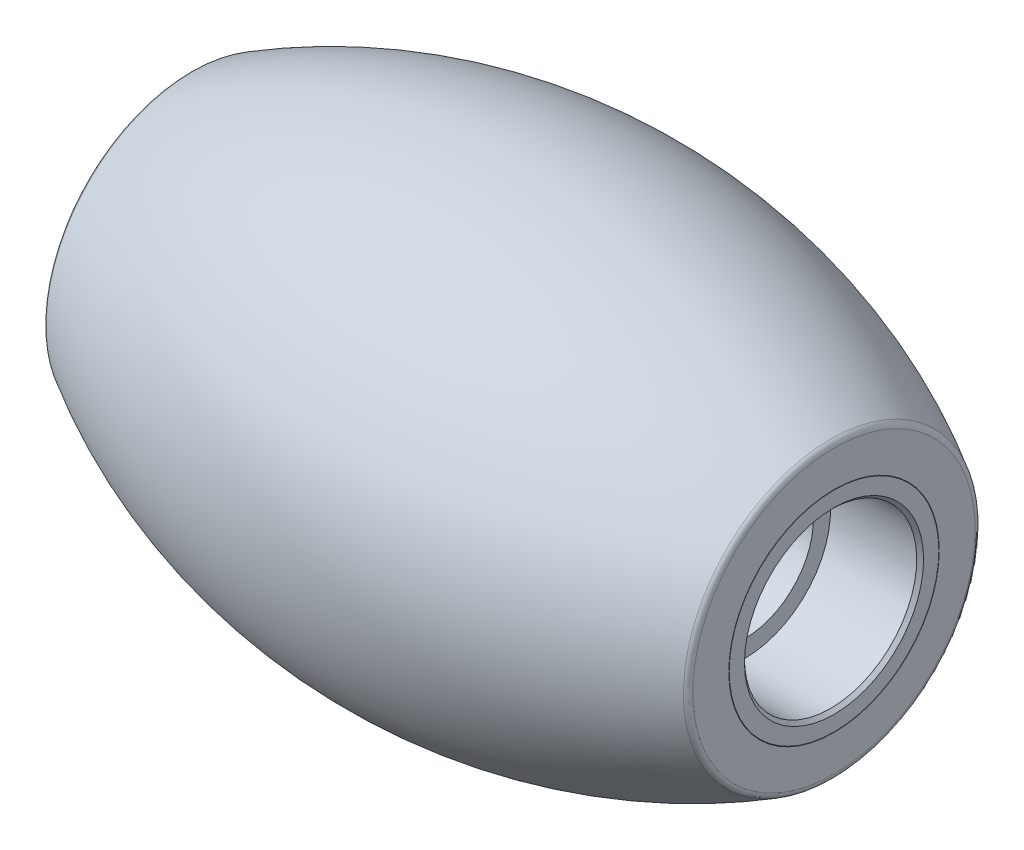
ISO-10303-21;
HEADER;
FILE_DESCRIPTION(('STEP AP214'),'2;1');
FILE_NAME('part.step','',(''),(''),'','','');
FILE_SCHEMA(('AUTOMOTIVE_DESIGN { 1 0 10303 214 1 1 1 1 }'));
ENDSEC;
DATA;
#1=APPLICATION_CONTEXT('core data for automotive mechanical design processes');
#2=APPLICATION_PROTOCOL_DEFINITION('international standard','automotive_design',2000,#1);
#3=PRODUCT_CONTEXT('',#1,'mechanical');
#4=PRODUCT('Part','Part','',(#3));
#5=PRODUCT_RELATED_PRODUCT_CATEGORY('part','',(#4));
#6=PRODUCT_DEFINITION_FORMATION('','',#4);
#7=PRODUCT_DEFINITION_CONTEXT('part definition',#1,'design');
#8=PRODUCT_DEFINITION('design','',#6,#7);
#9=PRODUCT_DEFINITION_SHAPE('','',#8);
#10=(LENGTH_UNIT() NAMED_UNIT(*) SI_UNIT(.MILLI.,.METRE.));
#11=(NAMED_UNIT(*) PLANE_ANGLE_UNIT() SI_UNIT($,.RADIAN.));
#12=(NAMED_UNIT(*) SI_UNIT($,.STERADIAN.) SOLID_ANGLE_UNIT());
#13=UNCERTAINTY_MEASURE_WITH_UNIT(LENGTH_MEASURE(1.E-05),#10,'distance_accuracy_value','');
#14=(GEOMETRIC_REPRESENTATION_CONTEXT(3) GLOBAL_UNCERTAINTY_ASSIGNED_CONTEXT((#13)) GLOBAL_UNIT_ASSIGNED_CONTEXT((#10,
#11,#12)) REPRESENTATION_CONTEXT('',''));
#15=CARTESIAN_POINT('',(0.,0.,0.));
#16=DIRECTION('',(0.,0.,1.));
#17=DIRECTION('',(1.,0.,0.));
#18=AXIS2_PLACEMENT_3D('',#15,#16,#17);
#19=CARTESIAN_POINT('',(0.,0.,0.));
#20=DIRECTION('',(-1.,0.,0.));
#21=DIRECTION('',(0.,-1.,0.));
#22=AXIS2_PLACEMENT_3D('',#19,#20,#21);
#23=DEGENERATE_TOROIDAL_SURFACE('',#22,11.75,17.51,.F.);
#24=CARTESIAN_POINT('',(9.35,0.,0.));
#25=DIRECTION('',(-1.,0.,0.));
#26=DIRECTION('',(0.,-1.,0.));
#27=AXIS2_PLACEMENT_3D('',#24,#25,#26);
#28=CIRCLE('',#27,3.05464791881252);
#29=CARTESIAN_POINT('',(9.35,-3.05464791881252,0.));
#30=VERTEX_POINT('',#29);
#31=EDGE_CURVE('E62',#30,#30,#28,.T.);
#32=ORIENTED_EDGE('',*,*,#31,.F.);
#33=EDGE_LOOP('',(#32));
#34=FACE_BOUND('',#33,.T.);
#35=CARTESIAN_POINT('',(-9.35,0.,0.));
#36=DIRECTION('',(-1.,0.,0.));
#37=DIRECTION('',(0.,-1.,0.));
#38=AXIS2_PLACEMENT_3D('',#35,#36,#37);
#39=CIRCLE('',#38,3.05464791881252);
#40=CARTESIAN_POINT('',(-9.35,-3.05464791881252,0.));
#41=VERTEX_POINT('',#40);
#42=EDGE_CURVE('E65',#41,#41,#39,.T.);
#43=ORIENTED_EDGE('',*,*,#42,.T.);
#44=EDGE_LOOP('',(#43));
#45=FACE_BOUND('',#44,.T.);
#46=ADVANCED_FACE('F42',(#34,#45),#23,.T.);
#47=CARTESIAN_POINT('',(9.35,3.05464791881252,0.));
#48=DIRECTION('',(-1.,0.,0.));
#49=DIRECTION('',(0.,-1.,0.));
#50=AXIS2_PLACEMENT_3D('',#47,#48,#49);
#51=PLANE('',#50);
#52=CARTESIAN_POINT('',(9.35,0.,0.));
#53=DIRECTION('',(-1.,0.,0.));
#54=DIRECTION('',(0.,-1.,0.));
#55=AXIS2_PLACEMENT_3D('',#52,#53,#54);
#56=CIRCLE('',#55,4.09826488925523);
#57=CARTESIAN_POINT('',(9.35,-4.09826488925522,0.));
#58=VERTEX_POINT('',#57);
#59=EDGE_CURVE('E11',#58,#58,#56,.F.);
#60=ORIENTED_EDGE('',*,*,#59,.T.);
#61=EDGE_LOOP('',(#60));
#62=FACE_BOUND('',#61,.T.);
#63=ORIENTED_EDGE('',*,*,#31,.T.);
#64=EDGE_LOOP('',(#63));
#65=FACE_BOUND('',#64,.T.);
#66=ADVANCED_FACE('F81',(#62,#65),#51,.F.);
#67=CARTESIAN_POINT('',(0.,0.,0.));
#68=DIRECTION('',(-1.,0.,0.));
#69=DIRECTION('',(0.,-1.,0.));
#70=AXIS2_PLACEMENT_3D('',#67,#68,#69);
#71=DEGENERATE_TOROIDAL_SURFACE('',#70,11.75,18.5,.F.);
#72=CARTESIAN_POINT('',(-9.25,0.,0.));
#73=DIRECTION('',(1.,0.,0.));
#74=DIRECTION('',(0.,1.,0.));
#75=AXIS2_PLACEMENT_3D('',#72,#73,#74);
#76=CIRCLE('',#75,4.27146997001212);
#77=CARTESIAN_POINT('',(-9.25,4.27146997001212,0.));
#78=VERTEX_POINT('',#77);
#79=EDGE_CURVE('E49',#78,#78,#76,.T.);
#80=ORIENTED_EDGE('',*,*,#79,.T.);
#81=EDGE_LOOP('',(#80));
#82=FACE_BOUND('',#81,.T.);
#83=CARTESIAN_POINT('',(9.25,0.,0.));
#84=DIRECTION('',(-1.,0.,0.));
#85=DIRECTION('',(0.,-1.,0.));
#86=AXIS2_PLACEMENT_3D('',#83,#84,#85);
#87=CIRCLE('',#86,4.27146997001211);
#88=CARTESIAN_POINT('',(9.25,-4.27146997001211,0.));
#89=VERTEX_POINT('',#88);
#90=EDGE_CURVE('E53',#89,#89,#87,.T.);
#91=ORIENTED_EDGE('',*,*,#90,.T.);
#92=EDGE_LOOP('',(#91));
#93=FACE_BOUND('',#92,.T.);
#94=ADVANCED_FACE('F73',(#82,#93),#71,.F.);
#95=CARTESIAN_POINT('',(-9.35,3.05464791881252,0.));
#96=DIRECTION('',(1.,0.,0.));
#97=DIRECTION('',(0.,1.,0.));
#98=AXIS2_PLACEMENT_3D('',#95,#96,#97);
#99=PLANE('',#98);
#100=CARTESIAN_POINT('',(-9.35,0.,0.));
#101=DIRECTION('',(1.,0.,0.));
#102=DIRECTION('',(0.,1.,0.));
#103=AXIS2_PLACEMENT_3D('',#100,#101,#102);
#104=CIRCLE('',#103,4.09826488925523);
#105=CARTESIAN_POINT('',(-9.35,4.09826488925523,0.));
#106=VERTEX_POINT('',#105);
#107=EDGE_CURVE('E57',#106,#106,#104,.F.);
#108=ORIENTED_EDGE('',*,*,#107,.T.);
#109=EDGE_LOOP('',(#108));
#110=FACE_BOUND('',#109,.T.);
#111=ORIENTED_EDGE('',*,*,#42,.F.);
#112=EDGE_LOOP('',(#111));
#113=FACE_BOUND('',#112,.T.);
#114=ADVANCED_FACE('F70',(#110,#113),#99,.F.);
#115=CARTESIAN_POINT('',(-9.15,0.,0.));
#116=DIRECTION('',(1.,0.,0.));
#117=DIRECTION('',(0.,1.,0.));
#118=AXIS2_PLACEMENT_3D('',#115,#116,#117);
#119=TOROIDAL_SURFACE('',#118,4.09826488925523,0.2);
#120=ORIENTED_EDGE('',*,*,#79,.F.);
#121=EDGE_LOOP('',(#120));
#122=FACE_BOUND('',#121,.T.);
#123=ORIENTED_EDGE('',*,*,#107,.F.);
#124=EDGE_LOOP('',(#123));
#125=FACE_BOUND('',#124,.T.);
#126=ADVANCED_FACE('F72',(#122,#125),#119,.T.);
#127=CARTESIAN_POINT('',(9.15,0.,0.));
#128=DIRECTION('',(-1.,0.,0.));
#129=DIRECTION('',(0.,-1.,0.));
#130=AXIS2_PLACEMENT_3D('',#127,#128,#129);
#131=TOROIDAL_SURFACE('',#130,4.09826488925523,0.2);
#132=ORIENTED_EDGE('',*,*,#59,.F.);
#133=EDGE_LOOP('',(#132));
#134=FACE_BOUND('',#133,.T.);
#135=ORIENTED_EDGE('',*,*,#90,.F.);
#136=EDGE_LOOP('',(#135));
#137=FACE_BOUND('',#136,.T.);
#138=ADVANCED_FACE('F44',(#134,#137),#131,.T.);
#139=CLOSED_SHELL('',(#46,#66,#94,#114,#126,#138));
#140=MANIFOLD_SOLID_BREP('B2',#139);
#141=CARTESIAN_POINT('',(-9.35,3.04281920392459,0.));
#142=DIRECTION('',(1.,0.,0.));
#143=DIRECTION('',(0.,1.,0.));
#144=AXIS2_PLACEMENT_3D('',#141,#142,#143);
#145=PLANE('',#144);
#146=CARTESIAN_POINT('',(-9.35,0.,0.));
#147=DIRECTION('',(1.,0.,0.));
#148=DIRECTION('',(0.,1.,0.));
#149=AXIS2_PLACEMENT_3D('',#146,#147,#148);
#150=CIRCLE('',#149,2.6);
#151=CARTESIAN_POINT('',(-9.35,2.6,0.));
#152=VERTEX_POINT('',#151);
#153=EDGE_CURVE('E144',#152,#152,#150,.T.);
#154=ORIENTED_EDGE('',*,*,#153,.T.);
#155=EDGE_LOOP('',(#154));
#156=FACE_BOUND('',#155,.T.);
#157=CARTESIAN_POINT('',(-9.35,0.,0.));
#158=DIRECTION('',(-1.,0.,0.));
#159=DIRECTION('',(0.,-1.,0.));
#160=AXIS2_PLACEMENT_3D('',#157,#158,#159);
#161=CIRCLE('',#160,3.04281920392459);
#162=CARTESIAN_POINT('',(-9.35,-3.04281920392459,0.));
#163=VERTEX_POINT('',#162);
#164=EDGE_CURVE('E153',#163,#163,#161,.T.);
#165=ORIENTED_EDGE('',*,*,#164,.T.);
#166=EDGE_LOOP('',(#165));
#167=FACE_BOUND('',#166,.T.);
#168=ADVANCED_FACE('F133',(#156,#167),#145,.F.);
#169=CARTESIAN_POINT('',(9.35,0.,0.));
#170=DIRECTION('',(-1.,0.,0.));
#171=DIRECTION('',(0.,-1.,0.));
#172=AXIS2_PLACEMENT_3D('',#169,#170,#171);
#173=PLANE('',#172);
#174=CARTESIAN_POINT('',(9.35,0.,0.));
#175=DIRECTION('',(-1.,0.,0.));
#176=DIRECTION('',(0.,-1.,0.));
#177=AXIS2_PLACEMENT_3D('',#174,#175,#176);
#178=CIRCLE('',#177,2.6);
#179=CARTESIAN_POINT('',(9.35,-2.59999999999999,0.));
#180=VERTEX_POINT('',#179);
#181=EDGE_CURVE('E140',#180,#180,#178,.T.);
#182=ORIENTED_EDGE('',*,*,#181,.T.);
#183=EDGE_LOOP('',(#182));
#184=FACE_BOUND('',#183,.T.);
#185=CARTESIAN_POINT('',(9.35,0.,0.));
#186=DIRECTION('',(-1.,0.,0.));
#187=DIRECTION('',(0.,-1.,0.));
#188=AXIS2_PLACEMENT_3D('',#185,#186,#187);
#189=CIRCLE('',#188,3.04281920392458);
#190=CARTESIAN_POINT('',(9.35,-3.04281920392458,0.));
#191=VERTEX_POINT('',#190);
#192=EDGE_CURVE('E156',#191,#191,#189,.T.);
#193=ORIENTED_EDGE('',*,*,#192,.F.);
#194=EDGE_LOOP('',(#193));
#195=FACE_BOUND('',#194,.T.);
#196=ADVANCED_FACE('F188',(#184,#195),#173,.F.);
#197=CARTESIAN_POINT('',(0.,0.,0.));
#198=DIRECTION('',(-1.,0.,0.));
#199=DIRECTION('',(0.,-1.,0.));
#200=AXIS2_PLACEMENT_3D('',#197,#198,#199);
#201=DEGENERATE_TOROIDAL_SURFACE('',#200,11.75,17.5,.F.);
#202=ORIENTED_EDGE('',*,*,#164,.F.);
#203=EDGE_LOOP('',(#202));
#204=FACE_BOUND('',#203,.T.);
#205=ORIENTED_EDGE('',*,*,#192,.T.);
#206=EDGE_LOOP('',(#205));
#207=FACE_BOUND('',#206,.T.);
#208=ADVANCED_FACE('F194',(#204,#207),#201,.F.);
#209=CARTESIAN_POINT('',(-9.35,0.,0.));
#210=DIRECTION('',(-1.,0.,0.));
#211=DIRECTION('',(0.,-1.,0.));
#212=AXIS2_PLACEMENT_3D('',#209,#210,#211);
#213=CYLINDRICAL_SURFACE('',#212,2.5);
#214=CARTESIAN_POINT('',(9.25,0.,0.));
#215=DIRECTION('',(-1.,0.,0.));
#216=DIRECTION('',(0.,-1.,0.));
#217=AXIS2_PLACEMENT_3D('',#214,#215,#216);
#218=CIRCLE('',#217,2.5);
#219=CARTESIAN_POINT('',(9.25,-2.49999999999999,0.));
#220=VERTEX_POINT('',#219);
#221=EDGE_CURVE('E41',#220,#220,#218,.F.);
#222=ORIENTED_EDGE('',*,*,#221,.T.);
#223=EDGE_LOOP('',(#222));
#224=FACE_BOUND('',#223,.T.);
#225=CARTESIAN_POINT('',(6.75,0.,0.));
#226=DIRECTION('',(-1.,0.,0.));
#227=DIRECTION('',(0.,-1.,0.));
#228=AXIS2_PLACEMENT_3D('',#225,#226,#227);
#229=CIRCLE('',#228,2.5);
#230=CARTESIAN_POINT('',(6.75,-2.49999999999999,0.));
#231=VERTEX_POINT('',#230);
#232=EDGE_CURVE('E159',#231,#231,#229,.T.);
#233=ORIENTED_EDGE('',*,*,#232,.T.);
#234=EDGE_LOOP('',(#233));
#235=FACE_BOUND('',#234,.T.);
#236=ADVANCED_FACE('F199',(#224,#235),#213,.F.);
#237=CARTESIAN_POINT('',(6.75,2.,0.));
#238=DIRECTION('',(1.,0.,0.));
#239=DIRECTION('',(0.,1.,0.));
#240=AXIS2_PLACEMENT_3D('',#237,#238,#239);
#241=PLANE('',#240);
#242=CARTESIAN_POINT('',(6.75,0.,0.));
#243=DIRECTION('',(-1.,0.,0.));
#244=DIRECTION('',(0.,-1.,0.));
#245=AXIS2_PLACEMENT_3D('',#242,#243,#244);
#246=CIRCLE('',#245,2.);
#247=CARTESIAN_POINT('',(6.75,-1.99999999999999,0.));
#248=VERTEX_POINT('',#247);
#249=EDGE_CURVE('E162',#248,#248,#246,.T.);
#250=ORIENTED_EDGE('',*,*,#249,.T.);
#251=EDGE_LOOP('',(#250));
#252=FACE_BOUND('',#251,.T.);
#253=ORIENTED_EDGE('',*,*,#232,.F.);
#254=EDGE_LOOP('',(#253));
#255=FACE_BOUND('',#254,.T.);
#256=ADVANCED_FACE('F204',(#252,#255),#241,.T.);
#257=CARTESIAN_POINT('',(-9.35,0.,0.));
#258=DIRECTION('',(-1.,0.,0.));
#259=DIRECTION('',(0.,-1.,0.));
#260=AXIS2_PLACEMENT_3D('',#257,#258,#259);
#261=CYLINDRICAL_SURFACE('',#260,2.);
#262=CARTESIAN_POINT('',(-6.75,0.,0.));
#263=DIRECTION('',(-1.,0.,0.));
#264=DIRECTION('',(0.,-1.,0.));
#265=AXIS2_PLACEMENT_3D('',#262,#263,#264);
#266=CIRCLE('',#265,2.);
#267=CARTESIAN_POINT('',(-6.75,-2.,0.));
#268=VERTEX_POINT('',#267);
#269=EDGE_CURVE('E165',#268,#268,#266,.T.);
#270=ORIENTED_EDGE('',*,*,#269,.T.);
#271=EDGE_LOOP('',(#270));
#272=FACE_BOUND('',#271,.T.);
#273=ORIENTED_EDGE('',*,*,#249,.F.);
#274=EDGE_LOOP('',(#273));
#275=FACE_BOUND('',#274,.T.);
#276=ADVANCED_FACE('F185',(#272,#275),#261,.F.);
#277=CARTESIAN_POINT('',(-6.75,2.5,0.));
#278=DIRECTION('',(-1.,0.,0.));
#279=DIRECTION('',(0.,-1.,0.));
#280=AXIS2_PLACEMENT_3D('',#277,#278,#279);
#281=PLANE('',#280);
#282=CARTESIAN_POINT('',(-6.75,0.,0.));
#283=DIRECTION('',(-1.,0.,0.));
#284=DIRECTION('',(0.,-1.,0.));
#285=AXIS2_PLACEMENT_3D('',#282,#283,#284);
#286=CIRCLE('',#285,2.5);
#287=CARTESIAN_POINT('',(-6.75,-2.5,0.));
#288=VERTEX_POINT('',#287);
#289=EDGE_CURVE('E168',#288,#288,#286,.T.);
#290=ORIENTED_EDGE('',*,*,#289,.T.);
#291=EDGE_LOOP('',(#290));
#292=FACE_BOUND('',#291,.T.);
#293=ORIENTED_EDGE('',*,*,#269,.F.);
#294=EDGE_LOOP('',(#293));
#295=FACE_BOUND('',#294,.T.);
#296=ADVANCED_FACE('F172',(#292,#295),#281,.T.);
#297=CARTESIAN_POINT('',(-9.35,0.,0.));
#298=DIRECTION('',(-1.,0.,0.));
#299=DIRECTION('',(0.,-1.,0.));
#300=AXIS2_PLACEMENT_3D('',#297,#298,#299);
#301=CYLINDRICAL_SURFACE('',#300,2.5);
#302=CARTESIAN_POINT('',(-9.25,0.,0.));
#303=DIRECTION('',(1.,0.,0.));
#304=DIRECTION('',(0.,1.,0.));
#305=AXIS2_PLACEMENT_3D('',#302,#303,#304);
#306=CIRCLE('',#305,2.5);
#307=CARTESIAN_POINT('',(-9.25,2.5,0.));
#308=VERTEX_POINT('',#307);
#309=EDGE_CURVE('E148',#308,#308,#306,.F.);
#310=ORIENTED_EDGE('',*,*,#309,.T.);
#311=EDGE_LOOP('',(#310));
#312=FACE_BOUND('',#311,.T.);
#313=ORIENTED_EDGE('',*,*,#289,.F.);
#314=EDGE_LOOP('',(#313));
#315=FACE_BOUND('',#314,.T.);
#316=ADVANCED_FACE('F175',(#312,#315),#301,.F.);
#317=CARTESIAN_POINT('',(-9.25,0.,0.));
#318=DIRECTION('',(-1.,0.,0.));
#319=DIRECTION('',(0.,-1.,0.));
#320=AXIS2_PLACEMENT_3D('',#317,#318,#319);
#321=CONICAL_SURFACE('',#320,2.5,0.785398163397455);
#322=ORIENTED_EDGE('',*,*,#153,.F.);
#323=EDGE_LOOP('',(#322));
#324=FACE_BOUND('',#323,.T.);
#325=ORIENTED_EDGE('',*,*,#309,.F.);
#326=EDGE_LOOP('',(#325));
#327=FACE_BOUND('',#326,.T.);
#328=ADVANCED_FACE('F177',(#324,#327),#321,.F.);
#329=CARTESIAN_POINT('',(9.35,0.,0.));
#330=DIRECTION('',(1.,0.,0.));
#331=DIRECTION('',(0.,1.,0.));
#332=AXIS2_PLACEMENT_3D('',#329,#330,#331);
#333=CONICAL_SURFACE('',#332,2.6,0.785398163397446);
#334=ORIENTED_EDGE('',*,*,#221,.F.);
#335=EDGE_LOOP('',(#334));
#336=FACE_BOUND('',#335,.T.);
#337=ORIENTED_EDGE('',*,*,#181,.F.);
#338=EDGE_LOOP('',(#337));
#339=FACE_BOUND('',#338,.T.);
#340=ADVANCED_FACE('F135',(#336,#339),#333,.F.);
#341=CLOSED_SHELL('',(#168,#196,#208,#236,#256,#276,#296,#316,#328,#340));
#342=MANIFOLD_SOLID_BREP('B6',#341);
#343=ADVANCED_BREP_SHAPE_REPRESENTATION('',(#18,#140,#342),#14);
#344=SHAPE_DEFINITION_REPRESENTATION(#9,#343);
ENDSEC;
END-ISO-10303-21;
